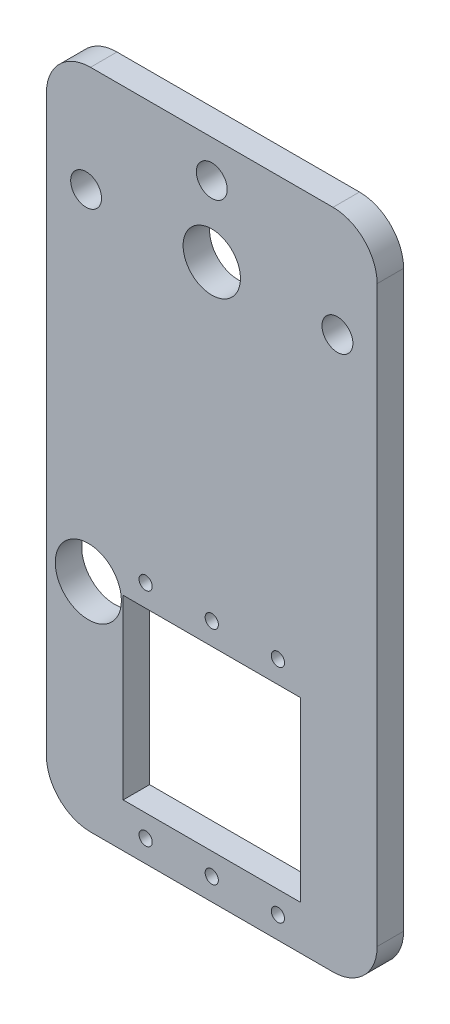
ISO-10303-21;
HEADER;
FILE_DESCRIPTION(('STEP AP214'),'2;1');
FILE_NAME('part.step','',(''),(''),'','','');
FILE_SCHEMA(('AUTOMOTIVE_DESIGN { 1 0 10303 214 1 1 1 1 }'));
ENDSEC;
DATA;
#1=APPLICATION_CONTEXT('core data for automotive mechanical design processes');
#2=APPLICATION_PROTOCOL_DEFINITION('international standard','automotive_design',2000,#1);
#3=PRODUCT_CONTEXT('',#1,'mechanical');
#4=PRODUCT('Part','Part','',(#3));
#5=PRODUCT_RELATED_PRODUCT_CATEGORY('part','',(#4));
#6=PRODUCT_DEFINITION_FORMATION('','',#4);
#7=PRODUCT_DEFINITION_CONTEXT('part definition',#1,'design');
#8=PRODUCT_DEFINITION('design','',#6,#7);
#9=PRODUCT_DEFINITION_SHAPE('','',#8);
#10=(LENGTH_UNIT() NAMED_UNIT(*) SI_UNIT(.MILLI.,.METRE.));
#11=(NAMED_UNIT(*) PLANE_ANGLE_UNIT() SI_UNIT($,.RADIAN.));
#12=(NAMED_UNIT(*) SI_UNIT($,.STERADIAN.) SOLID_ANGLE_UNIT());
#13=UNCERTAINTY_MEASURE_WITH_UNIT(LENGTH_MEASURE(1.E-05),#10,'distance_accuracy_value','');
#14=(GEOMETRIC_REPRESENTATION_CONTEXT(3) GLOBAL_UNCERTAINTY_ASSIGNED_CONTEXT((#13)) GLOBAL_UNIT_ASSIGNED_CONTEXT((#10,
#11,#12)) REPRESENTATION_CONTEXT('',''));
#15=CARTESIAN_POINT('',(0.,0.,0.));
#16=DIRECTION('',(0.,0.,1.));
#17=DIRECTION('',(1.,0.,0.));
#18=AXIS2_PLACEMENT_3D('',#15,#16,#17);
#19=CARTESIAN_POINT('',(37.5,75.1,-6.));
#20=DIRECTION('',(1.,0.,0.));
#21=DIRECTION('',(0.,1.,0.));
#22=AXIS2_PLACEMENT_3D('',#19,#20,#21);
#23=PLANE('',#22);
#24=DIRECTION('',(0.,1.,0.));
#25=VECTOR('',#24,1.);
#26=CARTESIAN_POINT('',(37.5,75.1,-6.));
#27=LINE('',#26,#25);
#28=CARTESIAN_POINT('',(37.5,-65.1,-6.));
#29=VERTEX_POINT('',#28);
#30=CARTESIAN_POINT('',(37.5,65.1000000000001,-6.));
#31=VERTEX_POINT('',#30);
#32=EDGE_CURVE('E200',#29,#31,#27,.T.);
#33=ORIENTED_EDGE('',*,*,#32,.T.);
#34=DIRECTION('',(0.,0.,1.));
#35=VECTOR('',#34,1.);
#36=CARTESIAN_POINT('',(37.5,65.1000000000001,-6.));
#37=LINE('',#36,#35);
#38=CARTESIAN_POINT('',(37.5,65.1000000000001,0.));
#39=VERTEX_POINT('',#38);
#40=EDGE_CURVE('E249',#31,#39,#37,.T.);
#41=ORIENTED_EDGE('',*,*,#40,.T.);
#42=DIRECTION('',(0.,1.,0.));
#43=VECTOR('',#42,1.);
#44=CARTESIAN_POINT('',(37.5,75.1,0.));
#45=LINE('',#44,#43);
#46=CARTESIAN_POINT('',(37.5,-65.1,0.));
#47=VERTEX_POINT('',#46);
#48=EDGE_CURVE('E197',#47,#39,#45,.T.);
#49=ORIENTED_EDGE('',*,*,#48,.F.);
#50=DIRECTION('',(0.,0.,1.));
#51=VECTOR('',#50,1.);
#52=CARTESIAN_POINT('',(37.5,-65.1,-6.));
#53=LINE('',#52,#51);
#54=EDGE_CURVE('E247',#47,#29,#53,.F.);
#55=ORIENTED_EDGE('',*,*,#54,.T.);
#56=EDGE_LOOP('',(#33,#41,#49,#55));
#57=FACE_BOUND('',#56,.T.);
#58=ADVANCED_FACE('F44',(#57),#23,.T.);
#59=CARTESIAN_POINT('',(-37.5,-75.1,-6.));
#60=DIRECTION('',(0.,-1.,0.));
#61=DIRECTION('',(0.,0.,-1.));
#62=AXIS2_PLACEMENT_3D('',#59,#60,#61);
#63=PLANE('',#62);
#64=DIRECTION('',(1.,0.,0.));
#65=VECTOR('',#64,1.);
#66=CARTESIAN_POINT('',(-37.5,-75.1,-6.));
#67=LINE('',#66,#65);
#68=CARTESIAN_POINT('',(-27.5,-75.1,-6.));
#69=VERTEX_POINT('',#68);
#70=CARTESIAN_POINT('',(27.5,-75.1,-6.));
#71=VERTEX_POINT('',#70);
#72=EDGE_CURVE('E210',#69,#71,#67,.T.);
#73=ORIENTED_EDGE('',*,*,#72,.T.);
#74=DIRECTION('',(0.,0.,1.));
#75=VECTOR('',#74,1.);
#76=CARTESIAN_POINT('',(27.5,-75.1,-6.));
#77=LINE('',#76,#75);
#78=CARTESIAN_POINT('',(27.5,-75.1,0.));
#79=VERTEX_POINT('',#78);
#80=EDGE_CURVE('E13',#71,#79,#77,.T.);
#81=ORIENTED_EDGE('',*,*,#80,.T.);
#82=DIRECTION('',(1.,0.,0.));
#83=VECTOR('',#82,1.);
#84=CARTESIAN_POINT('',(-37.5,-75.1,0.));
#85=LINE('',#84,#83);
#86=CARTESIAN_POINT('',(-27.5,-75.1,0.));
#87=VERTEX_POINT('',#86);
#88=EDGE_CURVE('E204',#87,#79,#85,.T.);
#89=ORIENTED_EDGE('',*,*,#88,.F.);
#90=DIRECTION('',(0.,0.,1.));
#91=VECTOR('',#90,1.);
#92=CARTESIAN_POINT('',(-27.5,-75.1,-6.));
#93=LINE('',#92,#91);
#94=EDGE_CURVE('E52',#87,#69,#93,.F.);
#95=ORIENTED_EDGE('',*,*,#94,.T.);
#96=EDGE_LOOP('',(#73,#81,#89,#95));
#97=FACE_BOUND('',#96,.T.);
#98=ADVANCED_FACE('F263',(#97),#63,.T.);
#99=CARTESIAN_POINT('',(-37.5,75.1,-6.));
#100=DIRECTION('',(-1.,0.,0.));
#101=DIRECTION('',(0.,-1.,0.));
#102=AXIS2_PLACEMENT_3D('',#99,#100,#101);
#103=PLANE('',#102);
#104=DIRECTION('',(0.,-1.,0.));
#105=VECTOR('',#104,1.);
#106=CARTESIAN_POINT('',(-37.5,75.1,0.));
#107=LINE('',#106,#105);
#108=CARTESIAN_POINT('',(-37.5,65.1000000000001,0.));
#109=VERTEX_POINT('',#108);
#110=CARTESIAN_POINT('',(-37.5,-65.1,0.));
#111=VERTEX_POINT('',#110);
#112=EDGE_CURVE('E218',#109,#111,#107,.T.);
#113=ORIENTED_EDGE('',*,*,#112,.F.);
#114=DIRECTION('',(0.,0.,1.));
#115=VECTOR('',#114,1.);
#116=CARTESIAN_POINT('',(-37.5,65.1000000000001,-6.));
#117=LINE('',#116,#115);
#118=CARTESIAN_POINT('',(-37.5,65.1000000000001,-6.));
#119=VERTEX_POINT('',#118);
#120=EDGE_CURVE('E238',#109,#119,#117,.F.);
#121=ORIENTED_EDGE('',*,*,#120,.T.);
#122=DIRECTION('',(0.,-1.,0.));
#123=VECTOR('',#122,1.);
#124=CARTESIAN_POINT('',(-37.5,75.1,-6.));
#125=LINE('',#124,#123);
#126=CARTESIAN_POINT('',(-37.5,-65.1,-6.));
#127=VERTEX_POINT('',#126);
#128=EDGE_CURVE('E207',#119,#127,#125,.T.);
#129=ORIENTED_EDGE('',*,*,#128,.T.);
#130=DIRECTION('',(0.,0.,1.));
#131=VECTOR('',#130,1.);
#132=CARTESIAN_POINT('',(-37.5,-65.1,-6.));
#133=LINE('',#132,#131);
#134=EDGE_CURVE('E235',#127,#111,#133,.T.);
#135=ORIENTED_EDGE('',*,*,#134,.T.);
#136=EDGE_LOOP('',(#113,#121,#129,#135));
#137=FACE_BOUND('',#136,.T.);
#138=ADVANCED_FACE('F270',(#137),#103,.T.);
#139=CARTESIAN_POINT('',(-37.5,75.1,-6.));
#140=DIRECTION('',(0.,1.,0.));
#141=DIRECTION('',(0.,0.,1.));
#142=AXIS2_PLACEMENT_3D('',#139,#140,#141);
#143=PLANE('',#142);
#144=DIRECTION('',(-1.,0.,0.));
#145=VECTOR('',#144,1.);
#146=CARTESIAN_POINT('',(-37.5,75.1,-6.));
#147=LINE('',#146,#145);
#148=CARTESIAN_POINT('',(27.5,75.1,-6.));
#149=VERTEX_POINT('',#148);
#150=CARTESIAN_POINT('',(-27.5,75.1,-6.));
#151=VERTEX_POINT('',#150);
#152=EDGE_CURVE('E203',#149,#151,#147,.T.);
#153=ORIENTED_EDGE('',*,*,#152,.T.);
#154=DIRECTION('',(0.,0.,1.));
#155=VECTOR('',#154,1.);
#156=CARTESIAN_POINT('',(-27.5,75.1,-6.));
#157=LINE('',#156,#155);
#158=CARTESIAN_POINT('',(-27.5,75.1,0.));
#159=VERTEX_POINT('',#158);
#160=EDGE_CURVE('E224',#151,#159,#157,.T.);
#161=ORIENTED_EDGE('',*,*,#160,.T.);
#162=DIRECTION('',(-1.,0.,0.));
#163=VECTOR('',#162,1.);
#164=CARTESIAN_POINT('',(-37.5,75.1,0.));
#165=LINE('',#164,#163);
#166=CARTESIAN_POINT('',(27.5,75.1,0.));
#167=VERTEX_POINT('',#166);
#168=EDGE_CURVE('E215',#167,#159,#165,.T.);
#169=ORIENTED_EDGE('',*,*,#168,.F.);
#170=DIRECTION('',(0.,0.,1.));
#171=VECTOR('',#170,1.);
#172=CARTESIAN_POINT('',(27.5,75.1,-6.));
#173=LINE('',#172,#171);
#174=EDGE_CURVE('E212',#167,#149,#173,.F.);
#175=ORIENTED_EDGE('',*,*,#174,.T.);
#176=EDGE_LOOP('',(#153,#161,#169,#175));
#177=FACE_BOUND('',#176,.T.);
#178=ADVANCED_FACE('F277',(#177),#143,.T.);
#179=CARTESIAN_POINT('',(0.,0.,-6.));
#180=DIRECTION('',(0.,0.,1.));
#181=DIRECTION('',(1.,0.,0.));
#182=AXIS2_PLACEMENT_3D('',#179,#180,#181);
#183=PLANE('',#182);
#184=CARTESIAN_POINT('',(-28.,-26.1568978137887,-6.));
#185=DIRECTION('',(0.,0.,1.));
#186=DIRECTION('',(1.,0.,0.));
#187=AXIS2_PLACEMENT_3D('',#184,#185,#186);
#188=CIRCLE('',#187,7.5);
#189=CARTESIAN_POINT('',(-20.5,-26.1568978137887,-6.));
#190=VERTEX_POINT('',#189);
#191=EDGE_CURVE('E368',#190,#190,#188,.T.);
#192=ORIENTED_EDGE('',*,*,#191,.T.);
#193=EDGE_LOOP('',(#192));
#194=FACE_BOUND('',#193,.T.);
#195=CARTESIAN_POINT('',(0.,50.6,-6.));
#196=DIRECTION('',(0.,0.,1.));
#197=DIRECTION('',(1.,0.,0.));
#198=AXIS2_PLACEMENT_3D('',#195,#196,#197);
#199=CIRCLE('',#198,6.5);
#200=CARTESIAN_POINT('',(6.5,50.6,-6.));
#201=VERTEX_POINT('',#200);
#202=EDGE_CURVE('E372',#201,#201,#199,.T.);
#203=ORIENTED_EDGE('',*,*,#202,.T.);
#204=EDGE_LOOP('',(#203));
#205=FACE_BOUND('',#204,.T.);
#206=CARTESIAN_POINT('',(15.,-70.1,-6.));
#207=DIRECTION('',(0.,0.,1.));
#208=DIRECTION('',(1.,0.,0.));
#209=AXIS2_PLACEMENT_3D('',#206,#207,#208);
#210=CIRCLE('',#209,1.5);
#211=CARTESIAN_POINT('',(16.5,-70.1,-6.));
#212=VERTEX_POINT('',#211);
#213=EDGE_CURVE('E379',#212,#212,#210,.T.);
#214=ORIENTED_EDGE('',*,*,#213,.T.);
#215=EDGE_LOOP('',(#214));
#216=FACE_BOUND('',#215,.T.);
#217=CARTESIAN_POINT('',(0.,-70.1,-6.));
#218=DIRECTION('',(0.,0.,1.));
#219=DIRECTION('',(1.,0.,0.));
#220=AXIS2_PLACEMENT_3D('',#217,#218,#219);
#221=CIRCLE('',#220,1.5);
#222=CARTESIAN_POINT('',(1.50000000000001,-70.1,-6.));
#223=VERTEX_POINT('',#222);
#224=EDGE_CURVE('E385',#223,#223,#221,.T.);
#225=ORIENTED_EDGE('',*,*,#224,.T.);
#226=EDGE_LOOP('',(#225));
#227=FACE_BOUND('',#226,.T.);
#228=CARTESIAN_POINT('',(15.,-19.9,-6.));
#229=DIRECTION('',(0.,0.,1.));
#230=DIRECTION('',(1.,0.,0.));
#231=AXIS2_PLACEMENT_3D('',#228,#229,#230);
#232=CIRCLE('',#231,1.49999999999999);
#233=CARTESIAN_POINT('',(16.5,-19.9,-6.));
#234=VERTEX_POINT('',#233);
#235=EDGE_CURVE('E391',#234,#234,#232,.T.);
#236=ORIENTED_EDGE('',*,*,#235,.T.);
#237=EDGE_LOOP('',(#236));
#238=FACE_BOUND('',#237,.T.);
#239=CARTESIAN_POINT('',(-15.,-70.1,-6.));
#240=DIRECTION('',(0.,0.,1.));
#241=DIRECTION('',(1.,0.,0.));
#242=AXIS2_PLACEMENT_3D('',#239,#240,#241);
#243=CIRCLE('',#242,1.5);
#244=CARTESIAN_POINT('',(-13.5,-70.1,-6.));
#245=VERTEX_POINT('',#244);
#246=EDGE_CURVE('E397',#245,#245,#243,.T.);
#247=ORIENTED_EDGE('',*,*,#246,.T.);
#248=EDGE_LOOP('',(#247));
#249=FACE_BOUND('',#248,.T.);
#250=CARTESIAN_POINT('',(0.,-19.9,-6.));
#251=DIRECTION('',(0.,0.,1.));
#252=DIRECTION('',(1.,0.,0.));
#253=AXIS2_PLACEMENT_3D('',#250,#251,#252);
#254=CIRCLE('',#253,1.5);
#255=CARTESIAN_POINT('',(1.5,-19.9,-6.));
#256=VERTEX_POINT('',#255);
#257=EDGE_CURVE('E403',#256,#256,#254,.T.);
#258=ORIENTED_EDGE('',*,*,#257,.T.);
#259=EDGE_LOOP('',(#258));
#260=FACE_BOUND('',#259,.T.);
#261=CARTESIAN_POINT('',(-15.,-19.9,-6.));
#262=DIRECTION('',(0.,0.,1.));
#263=DIRECTION('',(1.,0.,0.));
#264=AXIS2_PLACEMENT_3D('',#261,#262,#263);
#265=CIRCLE('',#264,1.5);
#266=CARTESIAN_POINT('',(-13.5,-19.9,-6.));
#267=VERTEX_POINT('',#266);
#268=EDGE_CURVE('E172',#267,#267,#265,.T.);
#269=ORIENTED_EDGE('',*,*,#268,.T.);
#270=EDGE_LOOP('',(#269));
#271=FACE_BOUND('',#270,.T.);
#272=DIRECTION('',(1.,0.,0.));
#273=VECTOR('',#272,1.);
#274=CARTESIAN_POINT('',(-20.1,-65.1,-6.));
#275=LINE('',#274,#273);
#276=CARTESIAN_POINT('',(-20.1,-65.1,-6.));
#277=VERTEX_POINT('',#276);
#278=CARTESIAN_POINT('',(20.1,-65.1,-6.));
#279=VERTEX_POINT('',#278);
#280=EDGE_CURVE('E146',#277,#279,#275,.T.);
#281=ORIENTED_EDGE('',*,*,#280,.T.);
#282=DIRECTION('',(0.,1.,0.));
#283=VECTOR('',#282,1.);
#284=CARTESIAN_POINT('',(20.1,-24.9,-6.));
#285=LINE('',#284,#283);
#286=CARTESIAN_POINT('',(20.1,-24.9,-6.));
#287=VERTEX_POINT('',#286);
#288=EDGE_CURVE('E138',#279,#287,#285,.T.);
#289=ORIENTED_EDGE('',*,*,#288,.T.);
#290=DIRECTION('',(-1.,0.,0.));
#291=VECTOR('',#290,1.);
#292=CARTESIAN_POINT('',(-20.1,-24.9,-6.));
#293=LINE('',#292,#291);
#294=CARTESIAN_POINT('',(-20.1,-24.9,-6.));
#295=VERTEX_POINT('',#294);
#296=EDGE_CURVE('E150',#287,#295,#293,.T.);
#297=ORIENTED_EDGE('',*,*,#296,.T.);
#298=DIRECTION('',(0.,-1.,0.));
#299=VECTOR('',#298,1.);
#300=CARTESIAN_POINT('',(-20.1,-24.9,-6.));
#301=LINE('',#300,#299);
#302=EDGE_CURVE('E154',#295,#277,#301,.T.);
#303=ORIENTED_EDGE('',*,*,#302,.T.);
#304=EDGE_LOOP('',(#281,#289,#297,#303));
#305=FACE_BOUND('',#304,.T.);
#306=CARTESIAN_POINT('',(0.,66.6,-6.));
#307=DIRECTION('',(0.,0.,1.));
#308=DIRECTION('',(1.,0.,0.));
#309=AXIS2_PLACEMENT_3D('',#306,#307,#308);
#310=CIRCLE('',#309,3.5);
#311=CARTESIAN_POINT('',(3.5,66.6,-6.));
#312=VERTEX_POINT('',#311);
#313=EDGE_CURVE('E182',#312,#312,#310,.T.);
#314=ORIENTED_EDGE('',*,*,#313,.T.);
#315=EDGE_LOOP('',(#314));
#316=FACE_BOUND('',#315,.T.);
#317=CARTESIAN_POINT('',(28.5,50.6,-6.));
#318=DIRECTION('',(0.,0.,1.));
#319=DIRECTION('',(1.,0.,0.));
#320=AXIS2_PLACEMENT_3D('',#317,#318,#319);
#321=CIRCLE('',#320,3.5);
#322=CARTESIAN_POINT('',(32.,50.6,-6.));
#323=VERTEX_POINT('',#322);
#324=EDGE_CURVE('E188',#323,#323,#321,.T.);
#325=ORIENTED_EDGE('',*,*,#324,.T.);
#326=EDGE_LOOP('',(#325));
#327=FACE_BOUND('',#326,.T.);
#328=CARTESIAN_POINT('',(-28.5,50.6,-6.));
#329=DIRECTION('',(0.,0.,1.));
#330=DIRECTION('',(1.,0.,0.));
#331=AXIS2_PLACEMENT_3D('',#328,#329,#330);
#332=CIRCLE('',#331,3.5);
#333=CARTESIAN_POINT('',(-25.,50.6,-6.));
#334=VERTEX_POINT('',#333);
#335=EDGE_CURVE('E194',#334,#334,#332,.T.);
#336=ORIENTED_EDGE('',*,*,#335,.T.);
#337=EDGE_LOOP('',(#336));
#338=FACE_BOUND('',#337,.T.);
#339=ORIENTED_EDGE('',*,*,#128,.F.);
#340=CARTESIAN_POINT('',(-27.5,65.1000000000001,-6.));
#341=DIRECTION('',(0.,0.,1.));
#342=DIRECTION('',(1.,0.,0.));
#343=AXIS2_PLACEMENT_3D('',#340,#341,#342);
#344=CIRCLE('',#343,10.);
#345=EDGE_CURVE('E245',#119,#151,#344,.F.);
#346=ORIENTED_EDGE('',*,*,#345,.T.);
#347=ORIENTED_EDGE('',*,*,#152,.F.);
#348=CARTESIAN_POINT('',(27.5,65.1000000000001,-6.));
#349=DIRECTION('',(0.,0.,1.));
#350=DIRECTION('',(1.,0.,0.));
#351=AXIS2_PLACEMENT_3D('',#348,#349,#350);
#352=CIRCLE('',#351,10.);
#353=EDGE_CURVE('E243',#149,#31,#352,.F.);
#354=ORIENTED_EDGE('',*,*,#353,.T.);
#355=ORIENTED_EDGE('',*,*,#32,.F.);
#356=CARTESIAN_POINT('',(27.5,-65.1,-6.));
#357=DIRECTION('',(0.,0.,1.));
#358=DIRECTION('',(1.,0.,0.));
#359=AXIS2_PLACEMENT_3D('',#356,#357,#358);
#360=CIRCLE('',#359,10.);
#361=EDGE_CURVE('E59',#29,#71,#360,.F.);
#362=ORIENTED_EDGE('',*,*,#361,.T.);
#363=ORIENTED_EDGE('',*,*,#72,.F.);
#364=CARTESIAN_POINT('',(-27.5,-65.1,-6.));
#365=DIRECTION('',(0.,0.,1.));
#366=DIRECTION('',(1.,0.,0.));
#367=AXIS2_PLACEMENT_3D('',#364,#365,#366);
#368=CIRCLE('',#367,10.);
#369=EDGE_CURVE('E240',#69,#127,#368,.F.);
#370=ORIENTED_EDGE('',*,*,#369,.T.);
#371=EDGE_LOOP('',(#339,#346,#347,#354,#355,#362,#363,#370));
#372=FACE_BOUND('',#371,.T.);
#373=ADVANCED_FACE('F156',(#194,#205,#216,#227,#238,#249,#260,#271,#305,#316,#327,#338,#372),
#183,.F.);
#374=CARTESIAN_POINT('',(0.,0.,0.));
#375=DIRECTION('',(0.,0.,1.));
#376=DIRECTION('',(1.,0.,0.));
#377=AXIS2_PLACEMENT_3D('',#374,#375,#376);
#378=PLANE('',#377);
#379=CARTESIAN_POINT('',(-28.,-26.1568978137887,0.));
#380=DIRECTION('',(0.,0.,1.));
#381=DIRECTION('',(1.,0.,0.));
#382=AXIS2_PLACEMENT_3D('',#379,#380,#381);
#383=CIRCLE('',#382,7.5);
#384=CARTESIAN_POINT('',(-20.5,-26.1568978137887,0.));
#385=VERTEX_POINT('',#384);
#386=EDGE_CURVE('E365',#385,#385,#383,.T.);
#387=ORIENTED_EDGE('',*,*,#386,.F.);
#388=EDGE_LOOP('',(#387));
#389=FACE_BOUND('',#388,.T.);
#390=CARTESIAN_POINT('',(0.,50.6,0.));
#391=DIRECTION('',(0.,0.,1.));
#392=DIRECTION('',(1.,0.,0.));
#393=AXIS2_PLACEMENT_3D('',#390,#391,#392);
#394=CIRCLE('',#393,6.5);
#395=CARTESIAN_POINT('',(6.5,50.6,0.));
#396=VERTEX_POINT('',#395);
#397=EDGE_CURVE('E369',#396,#396,#394,.T.);
#398=ORIENTED_EDGE('',*,*,#397,.F.);
#399=EDGE_LOOP('',(#398));
#400=FACE_BOUND('',#399,.T.);
#401=CARTESIAN_POINT('',(15.,-70.1,0.));
#402=DIRECTION('',(0.,0.,1.));
#403=DIRECTION('',(1.,0.,0.));
#404=AXIS2_PLACEMENT_3D('',#401,#402,#403);
#405=CIRCLE('',#404,1.5);
#406=CARTESIAN_POINT('',(16.5,-70.1,0.));
#407=VERTEX_POINT('',#406);
#408=EDGE_CURVE('E377',#407,#407,#405,.T.);
#409=ORIENTED_EDGE('',*,*,#408,.F.);
#410=EDGE_LOOP('',(#409));
#411=FACE_BOUND('',#410,.T.);
#412=CARTESIAN_POINT('',(0.,-70.1,0.));
#413=DIRECTION('',(0.,0.,1.));
#414=DIRECTION('',(1.,0.,0.));
#415=AXIS2_PLACEMENT_3D('',#412,#413,#414);
#416=CIRCLE('',#415,1.5);
#417=CARTESIAN_POINT('',(1.50000000000001,-70.1,0.));
#418=VERTEX_POINT('',#417);
#419=EDGE_CURVE('E382',#418,#418,#416,.T.);
#420=ORIENTED_EDGE('',*,*,#419,.F.);
#421=EDGE_LOOP('',(#420));
#422=FACE_BOUND('',#421,.T.);
#423=CARTESIAN_POINT('',(15.,-19.9,0.));
#424=DIRECTION('',(0.,0.,1.));
#425=DIRECTION('',(1.,0.,0.));
#426=AXIS2_PLACEMENT_3D('',#423,#424,#425);
#427=CIRCLE('',#426,1.49999999999999);
#428=CARTESIAN_POINT('',(16.5,-19.9,0.));
#429=VERTEX_POINT('',#428);
#430=EDGE_CURVE('E388',#429,#429,#427,.T.);
#431=ORIENTED_EDGE('',*,*,#430,.F.);
#432=EDGE_LOOP('',(#431));
#433=FACE_BOUND('',#432,.T.);
#434=CARTESIAN_POINT('',(-15.,-70.1,0.));
#435=DIRECTION('',(0.,0.,1.));
#436=DIRECTION('',(1.,0.,0.));
#437=AXIS2_PLACEMENT_3D('',#434,#435,#436);
#438=CIRCLE('',#437,1.5);
#439=CARTESIAN_POINT('',(-13.5,-70.1,0.));
#440=VERTEX_POINT('',#439);
#441=EDGE_CURVE('E394',#440,#440,#438,.T.);
#442=ORIENTED_EDGE('',*,*,#441,.F.);
#443=EDGE_LOOP('',(#442));
#444=FACE_BOUND('',#443,.T.);
#445=CARTESIAN_POINT('',(0.,-19.9,0.));
#446=DIRECTION('',(0.,0.,1.));
#447=DIRECTION('',(1.,0.,0.));
#448=AXIS2_PLACEMENT_3D('',#445,#446,#447);
#449=CIRCLE('',#448,1.5);
#450=CARTESIAN_POINT('',(1.5,-19.9,0.));
#451=VERTEX_POINT('',#450);
#452=EDGE_CURVE('E400',#451,#451,#449,.T.);
#453=ORIENTED_EDGE('',*,*,#452,.F.);
#454=EDGE_LOOP('',(#453));
#455=FACE_BOUND('',#454,.T.);
#456=CARTESIAN_POINT('',(-15.,-19.9,0.));
#457=DIRECTION('',(0.,0.,1.));
#458=DIRECTION('',(1.,0.,0.));
#459=AXIS2_PLACEMENT_3D('',#456,#457,#458);
#460=CIRCLE('',#459,1.5);
#461=CARTESIAN_POINT('',(-13.5,-19.9,0.));
#462=VERTEX_POINT('',#461);
#463=EDGE_CURVE('E165',#462,#462,#460,.T.);
#464=ORIENTED_EDGE('',*,*,#463,.F.);
#465=EDGE_LOOP('',(#464));
#466=FACE_BOUND('',#465,.T.);
#467=DIRECTION('',(0.,1.,0.));
#468=VECTOR('',#467,1.);
#469=CARTESIAN_POINT('',(20.1,-24.9,0.));
#470=LINE('',#469,#468);
#471=CARTESIAN_POINT('',(20.1,-65.1,0.));
#472=VERTEX_POINT('',#471);
#473=CARTESIAN_POINT('',(20.1,-24.9,0.));
#474=VERTEX_POINT('',#473);
#475=EDGE_CURVE('E141',#472,#474,#470,.T.);
#476=ORIENTED_EDGE('',*,*,#475,.F.);
#477=DIRECTION('',(1.,0.,0.));
#478=VECTOR('',#477,1.);
#479=CARTESIAN_POINT('',(-20.1,-65.1,0.));
#480=LINE('',#479,#478);
#481=CARTESIAN_POINT('',(-20.1,-65.1,0.));
#482=VERTEX_POINT('',#481);
#483=EDGE_CURVE('E159',#482,#472,#480,.T.);
#484=ORIENTED_EDGE('',*,*,#483,.F.);
#485=DIRECTION('',(0.,-1.,0.));
#486=VECTOR('',#485,1.);
#487=CARTESIAN_POINT('',(-20.1,-24.9,0.));
#488=LINE('',#487,#486);
#489=CARTESIAN_POINT('',(-20.1,-24.9,0.));
#490=VERTEX_POINT('',#489);
#491=EDGE_CURVE('E162',#490,#482,#488,.T.);
#492=ORIENTED_EDGE('',*,*,#491,.F.);
#493=DIRECTION('',(-1.,0.,0.));
#494=VECTOR('',#493,1.);
#495=CARTESIAN_POINT('',(-20.1,-24.9,0.));
#496=LINE('',#495,#494);
#497=EDGE_CURVE('E171',#474,#490,#496,.T.);
#498=ORIENTED_EDGE('',*,*,#497,.F.);
#499=EDGE_LOOP('',(#476,#484,#492,#498));
#500=FACE_BOUND('',#499,.T.);
#501=CARTESIAN_POINT('',(0.,66.6,0.));
#502=DIRECTION('',(0.,0.,1.));
#503=DIRECTION('',(1.,0.,0.));
#504=AXIS2_PLACEMENT_3D('',#501,#502,#503);
#505=CIRCLE('',#504,3.5);
#506=CARTESIAN_POINT('',(3.5,66.6,0.));
#507=VERTEX_POINT('',#506);
#508=EDGE_CURVE('E178',#507,#507,#505,.T.);
#509=ORIENTED_EDGE('',*,*,#508,.F.);
#510=EDGE_LOOP('',(#509));
#511=FACE_BOUND('',#510,.T.);
#512=CARTESIAN_POINT('',(28.5,50.6,0.));
#513=DIRECTION('',(0.,0.,1.));
#514=DIRECTION('',(1.,0.,0.));
#515=AXIS2_PLACEMENT_3D('',#512,#513,#514);
#516=CIRCLE('',#515,3.5);
#517=CARTESIAN_POINT('',(32.,50.6,0.));
#518=VERTEX_POINT('',#517);
#519=EDGE_CURVE('E185',#518,#518,#516,.T.);
#520=ORIENTED_EDGE('',*,*,#519,.F.);
#521=EDGE_LOOP('',(#520));
#522=FACE_BOUND('',#521,.T.);
#523=CARTESIAN_POINT('',(-28.5,50.6,0.));
#524=DIRECTION('',(0.,0.,1.));
#525=DIRECTION('',(1.,0.,0.));
#526=AXIS2_PLACEMENT_3D('',#523,#524,#525);
#527=CIRCLE('',#526,3.5);
#528=CARTESIAN_POINT('',(-25.,50.6,0.));
#529=VERTEX_POINT('',#528);
#530=EDGE_CURVE('E191',#529,#529,#527,.T.);
#531=ORIENTED_EDGE('',*,*,#530,.F.);
#532=EDGE_LOOP('',(#531));
#533=FACE_BOUND('',#532,.T.);
#534=ORIENTED_EDGE('',*,*,#168,.T.);
#535=CARTESIAN_POINT('',(-27.5,65.1000000000001,0.));
#536=DIRECTION('',(0.,0.,1.));
#537=DIRECTION('',(1.,0.,0.));
#538=AXIS2_PLACEMENT_3D('',#535,#536,#537);
#539=CIRCLE('',#538,10.);
#540=EDGE_CURVE('E233',#159,#109,#539,.T.);
#541=ORIENTED_EDGE('',*,*,#540,.T.);
#542=ORIENTED_EDGE('',*,*,#112,.T.);
#543=CARTESIAN_POINT('',(-27.5,-65.1,0.));
#544=DIRECTION('',(0.,0.,1.));
#545=DIRECTION('',(1.,0.,0.));
#546=AXIS2_PLACEMENT_3D('',#543,#544,#545);
#547=CIRCLE('',#546,10.);
#548=EDGE_CURVE('E227',#111,#87,#547,.T.);
#549=ORIENTED_EDGE('',*,*,#548,.T.);
#550=ORIENTED_EDGE('',*,*,#88,.T.);
#551=CARTESIAN_POINT('',(27.5,-65.1,0.));
#552=DIRECTION('',(0.,0.,1.));
#553=DIRECTION('',(1.,0.,0.));
#554=AXIS2_PLACEMENT_3D('',#551,#552,#553);
#555=CIRCLE('',#554,10.);
#556=EDGE_CURVE('E229',#79,#47,#555,.T.);
#557=ORIENTED_EDGE('',*,*,#556,.T.);
#558=ORIENTED_EDGE('',*,*,#48,.T.);
#559=CARTESIAN_POINT('',(27.5,65.1000000000001,0.));
#560=DIRECTION('',(0.,0.,1.));
#561=DIRECTION('',(1.,0.,0.));
#562=AXIS2_PLACEMENT_3D('',#559,#560,#561);
#563=CIRCLE('',#562,10.);
#564=EDGE_CURVE('E231',#39,#167,#563,.T.);
#565=ORIENTED_EDGE('',*,*,#564,.T.);
#566=EDGE_LOOP('',(#534,#541,#542,#549,#550,#557,#558,#565));
#567=FACE_BOUND('',#566,.T.);
#568=ADVANCED_FACE('F258',(#389,#400,#411,#422,#433,#444,#455,#466,#500,#511,#522,#533,#567),
#378,.T.);
#569=CARTESIAN_POINT('',(-28.5,50.6,-6.));
#570=DIRECTION('',(0.,0.,1.));
#571=DIRECTION('',(1.,0.,0.));
#572=AXIS2_PLACEMENT_3D('',#569,#570,#571);
#573=CYLINDRICAL_SURFACE('',#572,3.5);
#574=ORIENTED_EDGE('',*,*,#335,.F.);
#575=EDGE_LOOP('',(#574));
#576=FACE_BOUND('',#575,.T.);
#577=ORIENTED_EDGE('',*,*,#530,.T.);
#578=EDGE_LOOP('',(#577));
#579=FACE_BOUND('',#578,.T.);
#580=ADVANCED_FACE('F302',(#576,#579),#573,.F.);
#581=CARTESIAN_POINT('',(28.5,50.6,-6.));
#582=DIRECTION('',(0.,0.,1.));
#583=DIRECTION('',(1.,0.,0.));
#584=AXIS2_PLACEMENT_3D('',#581,#582,#583);
#585=CYLINDRICAL_SURFACE('',#584,3.5);
#586=ORIENTED_EDGE('',*,*,#324,.F.);
#587=EDGE_LOOP('',(#586));
#588=FACE_BOUND('',#587,.T.);
#589=ORIENTED_EDGE('',*,*,#519,.T.);
#590=EDGE_LOOP('',(#589));
#591=FACE_BOUND('',#590,.T.);
#592=ADVANCED_FACE('F309',(#588,#591),#585,.F.);
#593=CARTESIAN_POINT('',(0.,66.6,-6.));
#594=DIRECTION('',(0.,0.,1.));
#595=DIRECTION('',(1.,0.,0.));
#596=AXIS2_PLACEMENT_3D('',#593,#594,#595);
#597=CYLINDRICAL_SURFACE('',#596,3.5);
#598=ORIENTED_EDGE('',*,*,#313,.F.);
#599=EDGE_LOOP('',(#598));
#600=FACE_BOUND('',#599,.T.);
#601=ORIENTED_EDGE('',*,*,#508,.T.);
#602=EDGE_LOOP('',(#601));
#603=FACE_BOUND('',#602,.T.);
#604=ADVANCED_FACE('F313',(#600,#603),#597,.F.);
#605=CARTESIAN_POINT('',(20.1,-24.9,-6.));
#606=DIRECTION('',(1.,0.,0.));
#607=DIRECTION('',(0.,1.,0.));
#608=AXIS2_PLACEMENT_3D('',#605,#606,#607);
#609=PLANE('',#608);
#610=ORIENTED_EDGE('',*,*,#475,.T.);
#611=DIRECTION('',(0.,0.,1.));
#612=VECTOR('',#611,1.);
#613=CARTESIAN_POINT('',(20.1,-24.9,-6.));
#614=LINE('',#613,#612);
#615=EDGE_CURVE('E134',#287,#474,#614,.T.);
#616=ORIENTED_EDGE('',*,*,#615,.F.);
#617=ORIENTED_EDGE('',*,*,#288,.F.);
#618=DIRECTION('',(0.,0.,1.));
#619=VECTOR('',#618,1.);
#620=CARTESIAN_POINT('',(20.1,-65.1,-6.));
#621=LINE('',#620,#619);
#622=EDGE_CURVE('E176',#279,#472,#621,.T.);
#623=ORIENTED_EDGE('',*,*,#622,.T.);
#624=EDGE_LOOP('',(#610,#616,#617,#623));
#625=FACE_BOUND('',#624,.T.);
#626=ADVANCED_FACE('F136',(#625),#609,.F.);
#627=CARTESIAN_POINT('',(-20.1,-65.1,-6.));
#628=DIRECTION('',(0.,-1.,0.));
#629=DIRECTION('',(0.,0.,-1.));
#630=AXIS2_PLACEMENT_3D('',#627,#628,#629);
#631=PLANE('',#630);
#632=ORIENTED_EDGE('',*,*,#483,.T.);
#633=ORIENTED_EDGE('',*,*,#622,.F.);
#634=ORIENTED_EDGE('',*,*,#280,.F.);
#635=DIRECTION('',(0.,0.,1.));
#636=VECTOR('',#635,1.);
#637=CARTESIAN_POINT('',(-20.1,-65.1,-6.));
#638=LINE('',#637,#636);
#639=EDGE_CURVE('E179',#277,#482,#638,.T.);
#640=ORIENTED_EDGE('',*,*,#639,.T.);
#641=EDGE_LOOP('',(#632,#633,#634,#640));
#642=FACE_BOUND('',#641,.T.);
#643=ADVANCED_FACE('F320',(#642),#631,.F.);
#644=CARTESIAN_POINT('',(-20.1,-24.9,-6.));
#645=DIRECTION('',(-1.,0.,0.));
#646=DIRECTION('',(0.,-1.,0.));
#647=AXIS2_PLACEMENT_3D('',#644,#645,#646);
#648=PLANE('',#647);
#649=ORIENTED_EDGE('',*,*,#491,.T.);
#650=ORIENTED_EDGE('',*,*,#639,.F.);
#651=ORIENTED_EDGE('',*,*,#302,.F.);
#652=DIRECTION('',(0.,0.,1.));
#653=VECTOR('',#652,1.);
#654=CARTESIAN_POINT('',(-20.1,-24.9,-6.));
#655=LINE('',#654,#653);
#656=EDGE_CURVE('E145',#295,#490,#655,.T.);
#657=ORIENTED_EDGE('',*,*,#656,.T.);
#658=EDGE_LOOP('',(#649,#650,#651,#657));
#659=FACE_BOUND('',#658,.T.);
#660=ADVANCED_FACE('F324',(#659),#648,.F.);
#661=CARTESIAN_POINT('',(-20.1,-24.9,-6.));
#662=DIRECTION('',(0.,1.,0.));
#663=DIRECTION('',(0.,0.,1.));
#664=AXIS2_PLACEMENT_3D('',#661,#662,#663);
#665=PLANE('',#664);
#666=ORIENTED_EDGE('',*,*,#497,.T.);
#667=ORIENTED_EDGE('',*,*,#656,.F.);
#668=ORIENTED_EDGE('',*,*,#296,.F.);
#669=ORIENTED_EDGE('',*,*,#615,.T.);
#670=EDGE_LOOP('',(#666,#667,#668,#669));
#671=FACE_BOUND('',#670,.T.);
#672=ADVANCED_FACE('F151',(#671),#665,.F.);
#673=CARTESIAN_POINT('',(-15.,-19.9,-6.));
#674=DIRECTION('',(0.,0.,1.));
#675=DIRECTION('',(1.,0.,0.));
#676=AXIS2_PLACEMENT_3D('',#673,#674,#675);
#677=CYLINDRICAL_SURFACE('',#676,1.5);
#678=ORIENTED_EDGE('',*,*,#268,.F.);
#679=EDGE_LOOP('',(#678));
#680=FACE_BOUND('',#679,.T.);
#681=ORIENTED_EDGE('',*,*,#463,.T.);
#682=EDGE_LOOP('',(#681));
#683=FACE_BOUND('',#682,.T.);
#684=ADVANCED_FACE('F323',(#680,#683),#677,.F.);
#685=CARTESIAN_POINT('',(0.,-19.9,-6.));
#686=DIRECTION('',(0.,0.,1.));
#687=DIRECTION('',(1.,0.,0.));
#688=AXIS2_PLACEMENT_3D('',#685,#686,#687);
#689=CYLINDRICAL_SURFACE('',#688,1.5);
#690=ORIENTED_EDGE('',*,*,#257,.F.);
#691=EDGE_LOOP('',(#690));
#692=FACE_BOUND('',#691,.T.);
#693=ORIENTED_EDGE('',*,*,#452,.T.);
#694=EDGE_LOOP('',(#693));
#695=FACE_BOUND('',#694,.T.);
#696=ADVANCED_FACE('F333',(#692,#695),#689,.F.);
#697=CARTESIAN_POINT('',(-15.,-70.1,-6.));
#698=DIRECTION('',(0.,0.,1.));
#699=DIRECTION('',(1.,0.,0.));
#700=AXIS2_PLACEMENT_3D('',#697,#698,#699);
#701=CYLINDRICAL_SURFACE('',#700,1.5);
#702=ORIENTED_EDGE('',*,*,#246,.F.);
#703=EDGE_LOOP('',(#702));
#704=FACE_BOUND('',#703,.T.);
#705=ORIENTED_EDGE('',*,*,#441,.T.);
#706=EDGE_LOOP('',(#705));
#707=FACE_BOUND('',#706,.T.);
#708=ADVANCED_FACE('F337',(#704,#707),#701,.F.);
#709=CARTESIAN_POINT('',(15.,-19.9,-6.));
#710=DIRECTION('',(0.,0.,1.));
#711=DIRECTION('',(1.,0.,0.));
#712=AXIS2_PLACEMENT_3D('',#709,#710,#711);
#713=CYLINDRICAL_SURFACE('',#712,1.49999999999999);
#714=ORIENTED_EDGE('',*,*,#235,.F.);
#715=EDGE_LOOP('',(#714));
#716=FACE_BOUND('',#715,.T.);
#717=ORIENTED_EDGE('',*,*,#430,.T.);
#718=EDGE_LOOP('',(#717));
#719=FACE_BOUND('',#718,.T.);
#720=ADVANCED_FACE('F341',(#716,#719),#713,.F.);
#721=CARTESIAN_POINT('',(0.,-70.1,-6.));
#722=DIRECTION('',(0.,0.,1.));
#723=DIRECTION('',(1.,0.,0.));
#724=AXIS2_PLACEMENT_3D('',#721,#722,#723);
#725=CYLINDRICAL_SURFACE('',#724,1.5);
#726=ORIENTED_EDGE('',*,*,#224,.F.);
#727=EDGE_LOOP('',(#726));
#728=FACE_BOUND('',#727,.T.);
#729=ORIENTED_EDGE('',*,*,#419,.T.);
#730=EDGE_LOOP('',(#729));
#731=FACE_BOUND('',#730,.T.);
#732=ADVANCED_FACE('F345',(#728,#731),#725,.F.);
#733=CARTESIAN_POINT('',(15.,-70.1,-6.));
#734=DIRECTION('',(0.,0.,1.));
#735=DIRECTION('',(1.,0.,0.));
#736=AXIS2_PLACEMENT_3D('',#733,#734,#735);
#737=CYLINDRICAL_SURFACE('',#736,1.5);
#738=ORIENTED_EDGE('',*,*,#213,.F.);
#739=EDGE_LOOP('',(#738));
#740=FACE_BOUND('',#739,.T.);
#741=ORIENTED_EDGE('',*,*,#408,.T.);
#742=EDGE_LOOP('',(#741));
#743=FACE_BOUND('',#742,.T.);
#744=ADVANCED_FACE('F349',(#740,#743),#737,.F.);
#745=CARTESIAN_POINT('',(0.,50.6,-6.));
#746=DIRECTION('',(0.,0.,1.));
#747=DIRECTION('',(1.,0.,0.));
#748=AXIS2_PLACEMENT_3D('',#745,#746,#747);
#749=CYLINDRICAL_SURFACE('',#748,6.5);
#750=ORIENTED_EDGE('',*,*,#202,.F.);
#751=EDGE_LOOP('',(#750));
#752=FACE_BOUND('',#751,.T.);
#753=ORIENTED_EDGE('',*,*,#397,.T.);
#754=EDGE_LOOP('',(#753));
#755=FACE_BOUND('',#754,.T.);
#756=ADVANCED_FACE('F353',(#752,#755),#749,.F.);
#757=CARTESIAN_POINT('',(-28.,-26.1568978137887,-13.));
#758=DIRECTION('',(0.,0.,1.));
#759=DIRECTION('',(1.,0.,0.));
#760=AXIS2_PLACEMENT_3D('',#757,#758,#759);
#761=CYLINDRICAL_SURFACE('',#760,7.5);
#762=CARTESIAN_POINT('',(-20.5,-26.1568978137887,0.));
#763=CARTESIAN_POINT('',(-20.5,-26.1568978137887,-0.0625000000000001));
#764=CARTESIAN_POINT('',(-20.5,-26.1568978137887,-0.125));
#765=CARTESIAN_POINT('',(-20.5,-26.1568978137887,-0.25));
#766=CARTESIAN_POINT('',(-20.5,-26.1568978137887,-0.3125));
#767=CARTESIAN_POINT('',(-20.5,-26.1568978137887,-0.4375));
#768=CARTESIAN_POINT('',(-20.5,-26.1568978137887,-0.5));
#769=CARTESIAN_POINT('',(-20.5,-26.1568978137887,-0.625000000000001));
#770=CARTESIAN_POINT('',(-20.5,-26.1568978137887,-0.687500000000001));
#771=CARTESIAN_POINT('',(-20.5,-26.1568978137887,-0.812500000000001));
#772=CARTESIAN_POINT('',(-20.5,-26.1568978137887,-0.875000000000001));
#773=CARTESIAN_POINT('',(-20.5,-26.1568978137887,-1.));
#774=CARTESIAN_POINT('',(-20.5,-26.1568978137887,-1.0625));
#775=CARTESIAN_POINT('',(-20.5,-26.1568978137887,-1.1875));
#776=CARTESIAN_POINT('',(-20.5,-26.1568978137887,-1.25));
#777=CARTESIAN_POINT('',(-20.5,-26.1568978137887,-1.375));
#778=CARTESIAN_POINT('',(-20.5,-26.1568978137887,-1.4375));
#779=CARTESIAN_POINT('',(-20.5,-26.1568978137887,-1.5625));
#780=CARTESIAN_POINT('',(-20.5,-26.1568978137887,-1.625));
#781=CARTESIAN_POINT('',(-20.5,-26.1568978137887,-1.75));
#782=CARTESIAN_POINT('',(-20.5,-26.1568978137887,-1.8125));
#783=CARTESIAN_POINT('',(-20.5,-26.1568978137887,-1.9375));
#784=CARTESIAN_POINT('',(-20.5,-26.1568978137887,-2.));
#785=CARTESIAN_POINT('',(-20.5,-26.1568978137887,-2.125));
#786=CARTESIAN_POINT('',(-20.5,-26.1568978137887,-2.1875));
#787=CARTESIAN_POINT('',(-20.5,-26.1568978137887,-2.3125));
#788=CARTESIAN_POINT('',(-20.5,-26.1568978137887,-2.375));
#789=CARTESIAN_POINT('',(-20.5,-26.1568978137887,-2.5));
#790=CARTESIAN_POINT('',(-20.5,-26.1568978137887,-2.5625));
#791=CARTESIAN_POINT('',(-20.5,-26.1568978137887,-2.6875));
#792=CARTESIAN_POINT('',(-20.5,-26.1568978137887,-2.75));
#793=CARTESIAN_POINT('',(-20.5,-26.1568978137887,-2.875));
#794=CARTESIAN_POINT('',(-20.5,-26.1568978137887,-2.9375));
#795=CARTESIAN_POINT('',(-20.5,-26.1568978137887,-3.0625));
#796=CARTESIAN_POINT('',(-20.5,-26.1568978137887,-3.125));
#797=CARTESIAN_POINT('',(-20.5,-26.1568978137887,-3.25));
#798=CARTESIAN_POINT('',(-20.5,-26.1568978137887,-3.3125));
#799=CARTESIAN_POINT('',(-20.5,-26.1568978137887,-3.4375));
#800=CARTESIAN_POINT('',(-20.5,-26.1568978137887,-3.5));
#801=CARTESIAN_POINT('',(-20.5,-26.1568978137887,-3.625));
#802=CARTESIAN_POINT('',(-20.5,-26.1568978137887,-3.6875));
#803=CARTESIAN_POINT('',(-20.5,-26.1568978137887,-3.8125));
#804=CARTESIAN_POINT('',(-20.5,-26.1568978137887,-3.875));
#805=CARTESIAN_POINT('',(-20.5,-26.1568978137887,-4.));
#806=CARTESIAN_POINT('',(-20.5,-26.1568978137887,-4.0625));
#807=CARTESIAN_POINT('',(-20.5,-26.1568978137887,-4.1875));
#808=CARTESIAN_POINT('',(-20.5,-26.1568978137887,-4.25));
#809=CARTESIAN_POINT('',(-20.5,-26.1568978137887,-4.375));
#810=CARTESIAN_POINT('',(-20.5,-26.1568978137887,-4.4375));
#811=CARTESIAN_POINT('',(-20.5,-26.1568978137887,-4.5625));
#812=CARTESIAN_POINT('',(-20.5,-26.1568978137887,-4.625));
#813=CARTESIAN_POINT('',(-20.5,-26.1568978137887,-4.75));
#814=CARTESIAN_POINT('',(-20.5,-26.1568978137887,-4.8125));
#815=CARTESIAN_POINT('',(-20.5,-26.1568978137887,-4.9375));
#816=CARTESIAN_POINT('',(-20.5,-26.1568978137887,-5.));
#817=CARTESIAN_POINT('',(-20.5,-26.1568978137887,-5.125));
#818=CARTESIAN_POINT('',(-20.5,-26.1568978137887,-5.1875));
#819=CARTESIAN_POINT('',(-20.5,-26.1568978137887,-5.3125));
#820=CARTESIAN_POINT('',(-20.5,-26.1568978137887,-5.375));
#821=CARTESIAN_POINT('',(-20.5,-26.1568978137887,-5.5));
#822=CARTESIAN_POINT('',(-20.5,-26.1568978137887,-5.5625));
#823=CARTESIAN_POINT('',(-20.5,-26.1568978137887,-5.6875));
#824=CARTESIAN_POINT('',(-20.5,-26.1568978137887,-5.75));
#825=CARTESIAN_POINT('',(-20.5,-26.1568978137887,-5.875));
#826=CARTESIAN_POINT('',(-20.5,-26.1568978137887,-5.9375));
#827=CARTESIAN_POINT('',(-20.5,-26.1568978137887,-6.));
#828=B_SPLINE_CURVE_WITH_KNOTS('',3,(#762,#763,#764,#765,#766,#767,#768,#769,#770,#771,#772,
#773,#774,#775,#776,#777,#778,#779,#780,#781,#782,#783,#784,#785,#786,#787,#788,#789,#790,#791,
#792,#793,#794,#795,#796,#797,#798,#799,#800,#801,#802,#803,#804,#805,#806,#807,#808,#809,#810,
#811,#812,#813,#814,#815,#816,#817,#818,#819,#820,#821,#822,#823,#824,#825,#826,#827),
.UNSPECIFIED.,.F.,.F.,(4,2,2,2,2,2,2,2,2,2,2,2,2,2,2,2,2,2,2,2,2,2,2,2,2,2,2,2,2,2,2,2,4),(0.,
0.1875,0.375,0.5625,0.750000000000001,0.937500000000001,1.125,1.3125,1.5,1.6875,1.875,2.0625,
2.25,2.4375,2.625,2.8125,3.,3.1875,3.375,3.5625,3.75,3.9375,4.125,4.3125,4.5,4.6875,4.875,
5.0625,5.25,5.4375,5.625,5.8125,6.),.UNSPECIFIED.);
#829=EDGE_CURVE('BSEAM287',#385,#190,#828,.T.);
#830=ORIENTED_EDGE('',*,*,#386,.T.);
#831=ORIENTED_EDGE('',*,*,#191,.F.);
#832=ORIENTED_EDGE('',*,*,#829,.T.);
#833=ORIENTED_EDGE('',*,*,#829,.F.);
#834=EDGE_LOOP('',(#830,#832,#831,#833));
#835=FACE_BOUND('',#834,.T.);
#836=ADVANCED_FACE('F287',(#835),#761,.F.);
#837=CARTESIAN_POINT('',(-27.5,65.1000000000001,-6.));
#838=DIRECTION('',(0.,0.,1.));
#839=DIRECTION('',(1.,0.,0.));
#840=AXIS2_PLACEMENT_3D('',#837,#838,#839);
#841=CYLINDRICAL_SURFACE('',#840,10.);
#842=ORIENTED_EDGE('',*,*,#345,.F.);
#843=ORIENTED_EDGE('',*,*,#120,.F.);
#844=ORIENTED_EDGE('',*,*,#540,.F.);
#845=ORIENTED_EDGE('',*,*,#160,.F.);
#846=EDGE_LOOP('',(#842,#843,#844,#845));
#847=FACE_BOUND('',#846,.T.);
#848=ADVANCED_FACE('F275',(#847),#841,.T.);
#849=CARTESIAN_POINT('',(27.5,65.1000000000001,-6.));
#850=DIRECTION('',(0.,0.,1.));
#851=DIRECTION('',(1.,0.,0.));
#852=AXIS2_PLACEMENT_3D('',#849,#850,#851);
#853=CYLINDRICAL_SURFACE('',#852,10.);
#854=ORIENTED_EDGE('',*,*,#353,.F.);
#855=ORIENTED_EDGE('',*,*,#174,.F.);
#856=ORIENTED_EDGE('',*,*,#564,.F.);
#857=ORIENTED_EDGE('',*,*,#40,.F.);
#858=EDGE_LOOP('',(#854,#855,#856,#857));
#859=FACE_BOUND('',#858,.T.);
#860=ADVANCED_FACE('F280',(#859),#853,.T.);
#861=CARTESIAN_POINT('',(27.5,-65.1,-6.));
#862=DIRECTION('',(0.,0.,1.));
#863=DIRECTION('',(1.,0.,0.));
#864=AXIS2_PLACEMENT_3D('',#861,#862,#863);
#865=CYLINDRICAL_SURFACE('',#864,10.);
#866=ORIENTED_EDGE('',*,*,#361,.F.);
#867=ORIENTED_EDGE('',*,*,#54,.F.);
#868=ORIENTED_EDGE('',*,*,#556,.F.);
#869=ORIENTED_EDGE('',*,*,#80,.F.);
#870=EDGE_LOOP('',(#866,#867,#868,#869));
#871=FACE_BOUND('',#870,.T.);
#872=ADVANCED_FACE('F262',(#871),#865,.T.);
#873=CARTESIAN_POINT('',(-27.5,-65.1,-6.));
#874=DIRECTION('',(0.,0.,1.));
#875=DIRECTION('',(1.,0.,0.));
#876=AXIS2_PLACEMENT_3D('',#873,#874,#875);
#877=CYLINDRICAL_SURFACE('',#876,10.);
#878=ORIENTED_EDGE('',*,*,#369,.F.);
#879=ORIENTED_EDGE('',*,*,#94,.F.);
#880=ORIENTED_EDGE('',*,*,#548,.F.);
#881=ORIENTED_EDGE('',*,*,#134,.F.);
#882=EDGE_LOOP('',(#878,#879,#880,#881));
#883=FACE_BOUND('',#882,.T.);
#884=ADVANCED_FACE('F46',(#883),#877,.T.);
#885=CLOSED_SHELL('',(#58,#98,#138,#178,#373,#568,#580,#592,#604,#626,#643,#660,#672,#684,#696,
#708,#720,#732,#744,#756,#836,#848,#860,#872,#884));
#886=MANIFOLD_SOLID_BREP('B2',#885);
#887=ADVANCED_BREP_SHAPE_REPRESENTATION('',(#18,#886),#14);
#888=SHAPE_DEFINITION_REPRESENTATION(#9,#887);
ENDSEC;
END-ISO-10303-21;
